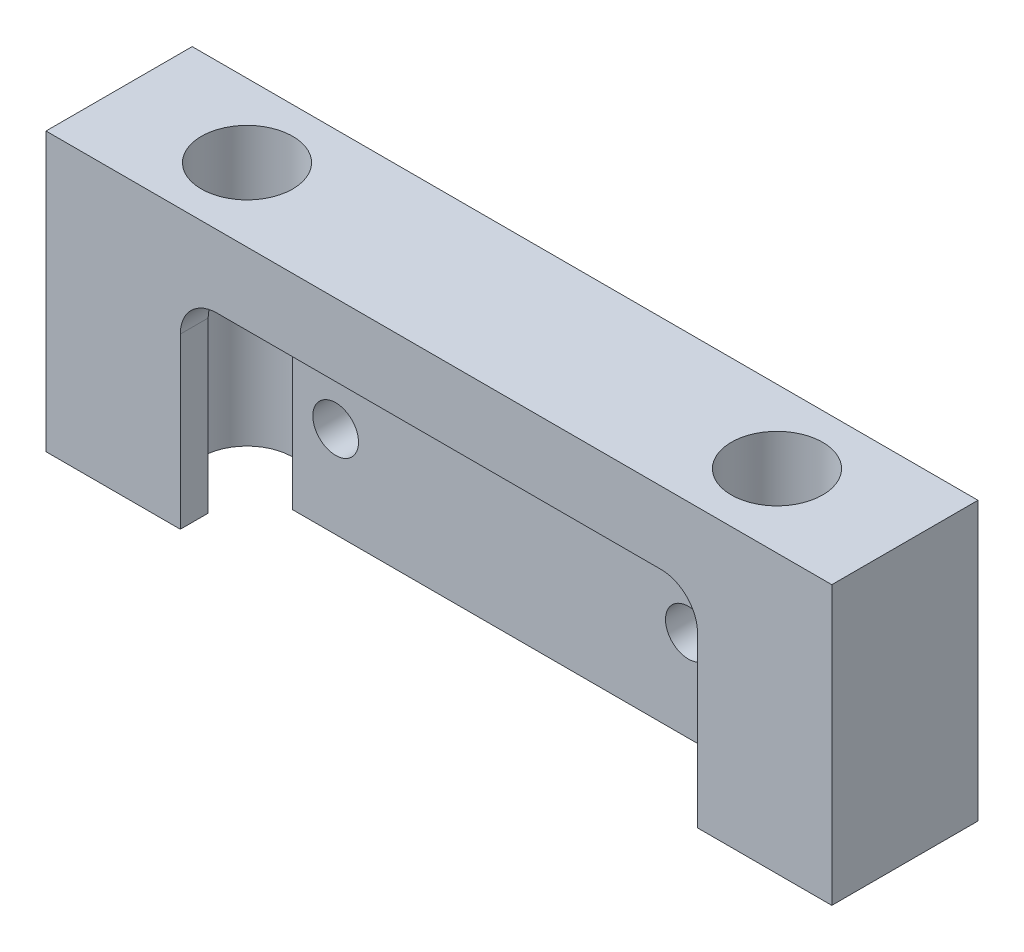
ISO-10303-21;
HEADER;
FILE_DESCRIPTION(('STEP AP214'),'2;1');
FILE_NAME('part.step','',(''),(''),'','','');
FILE_SCHEMA(('AUTOMOTIVE_DESIGN { 1 0 10303 214 1 1 1 1 }'));
ENDSEC;
DATA;
#1=APPLICATION_CONTEXT('core data for automotive mechanical design processes');
#2=APPLICATION_PROTOCOL_DEFINITION('international standard','automotive_design',2000,#1);
#3=PRODUCT_CONTEXT('',#1,'mechanical');
#4=PRODUCT('Part','Part','',(#3));
#5=PRODUCT_RELATED_PRODUCT_CATEGORY('part','',(#4));
#6=PRODUCT_DEFINITION_FORMATION('','',#4);
#7=PRODUCT_DEFINITION_CONTEXT('part definition',#1,'design');
#8=PRODUCT_DEFINITION('design','',#6,#7);
#9=PRODUCT_DEFINITION_SHAPE('','',#8);
#10=(LENGTH_UNIT() NAMED_UNIT(*) SI_UNIT(.MILLI.,.METRE.));
#11=(NAMED_UNIT(*) PLANE_ANGLE_UNIT() SI_UNIT($,.RADIAN.));
#12=(NAMED_UNIT(*) SI_UNIT($,.STERADIAN.) SOLID_ANGLE_UNIT());
#13=UNCERTAINTY_MEASURE_WITH_UNIT(LENGTH_MEASURE(1.E-05),#10,'distance_accuracy_value','');
#14=(GEOMETRIC_REPRESENTATION_CONTEXT(3) GLOBAL_UNCERTAINTY_ASSIGNED_CONTEXT((#13)) GLOBAL_UNIT_ASSIGNED_CONTEXT((#10,
#11,#12)) REPRESENTATION_CONTEXT('',''));
#15=CARTESIAN_POINT('',(0.,0.,0.));
#16=DIRECTION('',(0.,0.,1.));
#17=DIRECTION('',(1.,0.,0.));
#18=AXIS2_PLACEMENT_3D('',#15,#16,#17);
#19=CARTESIAN_POINT('',(-9.65,-2.60000000000001,4.));
#20=DIRECTION('',(0.,0.,1.));
#21=DIRECTION('',(1.,0.,0.));
#22=AXIS2_PLACEMENT_3D('',#19,#20,#21);
#23=CYLINDRICAL_SURFACE('',#22,1.24999999999999);
#24=CARTESIAN_POINT('',(-9.65,-2.60000000000001,4.));
#25=DIRECTION('',(0.,0.,-1.));
#26=DIRECTION('',(-1.,0.,0.));
#27=AXIS2_PLACEMENT_3D('',#24,#25,#26);
#28=CIRCLE('',#27,1.24999999999999);
#29=CARTESIAN_POINT('',(-10.9,-2.60000000000001,4.));
#30=VERTEX_POINT('',#29);
#31=EDGE_CURVE('E11',#30,#30,#28,.F.);
#32=ORIENTED_EDGE('',*,*,#31,.T.);
#33=EDGE_LOOP('',(#32));
#34=FACE_BOUND('',#33,.T.);
#35=CARTESIAN_POINT('',(-9.65,-2.60000000000001,0.));
#36=DIRECTION('',(0.,0.,1.));
#37=DIRECTION('',(1.,0.,0.));
#38=AXIS2_PLACEMENT_3D('',#35,#36,#37);
#39=CIRCLE('',#38,1.24999999999999);
#40=CARTESIAN_POINT('',(-8.40000000000001,-2.60000000000001,0.));
#41=VERTEX_POINT('',#40);
#42=EDGE_CURVE('E193',#41,#41,#39,.T.);
#43=ORIENTED_EDGE('',*,*,#42,.F.);
#44=EDGE_LOOP('',(#43));
#45=FACE_BOUND('',#44,.T.);
#46=ADVANCED_FACE('F16',(#34,#45),#23,.F.);
#47=CARTESIAN_POINT('',(9.65,-2.60000000000001,4.));
#48=DIRECTION('',(0.,0.,1.));
#49=DIRECTION('',(1.,0.,0.));
#50=AXIS2_PLACEMENT_3D('',#47,#48,#49);
#51=CYLINDRICAL_SURFACE('',#50,1.24999999999999);
#52=CARTESIAN_POINT('',(9.65,-2.60000000000001,4.));
#53=DIRECTION('',(0.,0.,-1.));
#54=DIRECTION('',(-1.,0.,0.));
#55=AXIS2_PLACEMENT_3D('',#52,#53,#54);
#56=CIRCLE('',#55,1.24999999999999);
#57=CARTESIAN_POINT('',(8.40000000000001,-2.60000000000001,4.));
#58=VERTEX_POINT('',#57);
#59=EDGE_CURVE('E32',#58,#58,#56,.F.);
#60=ORIENTED_EDGE('',*,*,#59,.T.);
#61=EDGE_LOOP('',(#60));
#62=FACE_BOUND('',#61,.T.);
#63=CARTESIAN_POINT('',(9.65,-2.60000000000001,0.));
#64=DIRECTION('',(0.,0.,1.));
#65=DIRECTION('',(1.,0.,0.));
#66=AXIS2_PLACEMENT_3D('',#63,#64,#65);
#67=CIRCLE('',#66,1.24999999999999);
#68=CARTESIAN_POINT('',(10.9,-2.60000000000001,0.));
#69=VERTEX_POINT('',#68);
#70=EDGE_CURVE('E196',#69,#69,#67,.T.);
#71=ORIENTED_EDGE('',*,*,#70,.F.);
#72=EDGE_LOOP('',(#71));
#73=FACE_BOUND('',#72,.T.);
#74=ADVANCED_FACE('F227',(#62,#73),#51,.F.);
#75=CARTESIAN_POINT('',(14.5,-7.6,4.));
#76=DIRECTION('',(0.,1.,0.));
#77=DIRECTION('',(1.,0.,0.));
#78=AXIS2_PLACEMENT_3D('',#75,#76,#77);
#79=CYLINDRICAL_SURFACE('',#78,2.5);
#80=CARTESIAN_POINT('',(14.5,7.6,4.));
#81=DIRECTION('',(0.,-1.,0.));
#82=DIRECTION('',(1.,0.,0.));
#83=AXIS2_PLACEMENT_3D('',#80,#81,#82);
#84=CIRCLE('',#83,2.5);
#85=CARTESIAN_POINT('',(17.,7.6,4.));
#86=VERTEX_POINT('',#85);
#87=EDGE_CURVE('E147',#86,#86,#84,.F.);
#88=ORIENTED_EDGE('',*,*,#87,.T.);
#89=EDGE_LOOP('',(#88));
#90=FACE_BOUND('',#89,.T.);
#91=CARTESIAN_POINT('',(14.5,-7.6,4.));
#92=DIRECTION('',(0.,1.,0.));
#93=DIRECTION('',(-1.,0.,0.));
#94=AXIS2_PLACEMENT_3D('',#91,#92,#93);
#95=CIRCLE('',#94,2.5);
#96=CARTESIAN_POINT('',(14.15,-7.6,6.47537875889731));
#97=VERTEX_POINT('',#96);
#98=CARTESIAN_POINT('',(12.,-7.6,4.));
#99=VERTEX_POINT('',#98);
#100=EDGE_CURVE('E158',#97,#99,#95,.T.);
#101=ORIENTED_EDGE('',*,*,#100,.F.);
#102=DIRECTION('',(0.,1.,0.));
#103=VECTOR('',#102,1.);
#104=CARTESIAN_POINT('',(14.15,-7.6,6.47537875889731));
#105=LINE('',#104,#103);
#106=CARTESIAN_POINT('',(14.15,1.65,6.47537875889731));
#107=VERTEX_POINT('',#106);
#108=EDGE_CURVE('E41',#107,#97,#105,.F.);
#109=ORIENTED_EDGE('',*,*,#108,.F.);
#110=CARTESIAN_POINT('',(12.15,3.65,4.85293610546162));
#111=CARTESIAN_POINT('',(12.1717848541757,3.6499871335958,4.91297632023183));
#112=CARTESIAN_POINT('',(12.1958851193623,3.64964359380251,4.97218391836945));
#113=CARTESIAN_POINT('',(12.2485565277098,3.64774763479541,5.088614005451));
#114=CARTESIAN_POINT('',(12.2771314052821,3.6461942014892,5.14583478706523));
#115=CARTESIAN_POINT('',(12.3387238981192,3.64131572400631,5.25817756561177));
#116=CARTESIAN_POINT('',(12.3717650914862,3.63798097980139,5.3132862833861));
#117=CARTESIAN_POINT('',(12.441866450778,3.62890478108905,5.42063382000006));
#118=CARTESIAN_POINT('',(12.4789250214157,3.62316427932358,5.47287376569442));
#119=CARTESIAN_POINT('',(12.5832367522469,3.60364526187424,5.60856830992434));
#120=CARTESIAN_POINT('',(12.6538863816249,3.58705530510053,5.68909318330374));
#121=CARTESIAN_POINT('',(12.8027915276664,3.54205638987283,5.83863536146666));
#122=CARTESIAN_POINT('',(12.8810233613841,3.5136833782133,5.90768677909109));
#123=CARTESIAN_POINT('',(13.0419027406321,3.44228584391287,6.03333042357918));
#124=CARTESIAN_POINT('',(13.1245783709508,3.39915579430451,6.08982794014689));
#125=CARTESIAN_POINT('',(13.2885707699964,3.29710695990994,6.1889806137309));
#126=CARTESIAN_POINT('',(13.3698871708759,3.23818397229663,6.23163207933636));
#127=CARTESIAN_POINT('',(13.5170385341964,3.1127074452584,6.29992387515111));
#128=CARTESIAN_POINT('',(13.5835908695181,3.04772011568174,6.32692445982034));
#129=CARTESIAN_POINT('',(13.7081444716002,2.90737303688636,6.37220650898323));
#130=CARTESIAN_POINT('',(13.7661454883834,2.83201298457052,6.39048771862185));
#131=CARTESIAN_POINT('',(13.8724516561465,2.67111528761236,6.42060199615144));
#132=CARTESIAN_POINT('',(13.9205111454733,2.58538782544805,6.43228182433444));
#133=CARTESIAN_POINT('',(14.0036882675448,2.40729602295369,6.45061210329801));
#134=CARTESIAN_POINT('',(14.0387991004357,2.31492822585565,6.4572599134891));
#135=CARTESIAN_POINT('',(14.0806630129234,2.17428327920328,6.46461816844701));
#136=CARTESIAN_POINT('',(14.0927398056377,2.12758777760779,6.46662684664851));
#137=CARTESIAN_POINT('',(14.1134959264118,2.03341303868675,6.46996492167655));
#138=CARTESIAN_POINT('',(14.1221752531751,1.98593380106214,6.47129431824387));
#139=CARTESIAN_POINT('',(14.1360713587403,1.8905067949881,6.47337977689398));
#140=CARTESIAN_POINT('',(14.1412913298037,1.84255950004259,6.47413636764879));
#141=CARTESIAN_POINT('',(14.1482571997862,1.74640854310065,6.4751321348508));
#142=CARTESIAN_POINT('',(14.15000314968,1.69820488487628,6.47537131888998));
#143=CARTESIAN_POINT('',(14.15,1.65,6.47537875889731));
#144=B_SPLINE_CURVE_WITH_KNOTS('',3,(#110,#111,#112,#113,#114,#115,#116,#117,#118,#119,#120,
#121,#122,#123,#124,#125,#126,#127,#128,#129,#130,#131,#132,#133,#134,#135,#136,#137,#138,#139,
#140,#141,#142,#143),.UNSPECIFIED.,.F.,.F.,(4,2,2,2,2,2,2,2,2,2,2,2,2,2,2,2,4),(0.,
0.191573364124514,0.383307471684327,0.576096462140483,0.768809175232548,1.09256623422289,
1.41534277355889,1.74047746189534,2.06569876134767,2.35492692554187,2.64416354294939,
2.93986427487028,3.23572007061787,3.38043592307214,3.52515183075043,3.66973400927846,
3.81431406632033),.UNSPECIFIED.);
#145=CARTESIAN_POINT('',(12.15,3.65,4.85293610546161));
#146=VERTEX_POINT('',#145);
#147=EDGE_CURVE('E130',#146,#107,#144,.T.);
#148=ORIENTED_EDGE('',*,*,#147,.F.);
#149=CARTESIAN_POINT('',(14.5,3.65,4.));
#150=DIRECTION('',(0.,1.,0.));
#151=DIRECTION('',(-1.,0.,0.));
#152=AXIS2_PLACEMENT_3D('',#149,#150,#151);
#153=CIRCLE('',#152,2.5);
#154=CARTESIAN_POINT('',(12.,3.65,4.));
#155=VERTEX_POINT('',#154);
#156=EDGE_CURVE('E203',#155,#146,#153,.T.);
#157=ORIENTED_EDGE('',*,*,#156,.F.);
#158=DIRECTION('',(0.,1.,0.));
#159=VECTOR('',#158,1.);
#160=CARTESIAN_POINT('',(12.,-7.6,4.));
#161=LINE('',#160,#159);
#162=EDGE_CURVE('E211',#99,#155,#161,.T.);
#163=ORIENTED_EDGE('',*,*,#162,.F.);
#164=EDGE_LOOP('',(#101,#109,#148,#157,#163));
#165=FACE_BOUND('',#164,.T.);
#166=ADVANCED_FACE('F222',(#90,#165),#79,.F.);
#167=CARTESIAN_POINT('',(-14.5,-7.60000000000001,4.));
#168=DIRECTION('',(0.,1.,0.));
#169=DIRECTION('',(1.,0.,0.));
#170=AXIS2_PLACEMENT_3D('',#167,#168,#169);
#171=CYLINDRICAL_SURFACE('',#170,2.5);
#172=CARTESIAN_POINT('',(-14.5,7.6,4.));
#173=DIRECTION('',(0.,-1.,0.));
#174=DIRECTION('',(1.,0.,0.));
#175=AXIS2_PLACEMENT_3D('',#172,#173,#174);
#176=CIRCLE('',#175,2.5);
#177=CARTESIAN_POINT('',(-12.,7.6,4.));
#178=VERTEX_POINT('',#177);
#179=EDGE_CURVE('E150',#178,#178,#176,.F.);
#180=ORIENTED_EDGE('',*,*,#179,.T.);
#181=EDGE_LOOP('',(#180));
#182=FACE_BOUND('',#181,.T.);
#183=CARTESIAN_POINT('',(-14.5,3.65,4.));
#184=DIRECTION('',(0.,1.,0.));
#185=DIRECTION('',(-1.,0.,0.));
#186=AXIS2_PLACEMENT_3D('',#183,#184,#185);
#187=CIRCLE('',#186,2.5);
#188=CARTESIAN_POINT('',(-12.15,3.65,4.85293610546159));
#189=VERTEX_POINT('',#188);
#190=CARTESIAN_POINT('',(-12.,3.65,4.));
#191=VERTEX_POINT('',#190);
#192=EDGE_CURVE('E131',#189,#191,#187,.T.);
#193=ORIENTED_EDGE('',*,*,#192,.F.);
#194=CARTESIAN_POINT('',(-14.15,1.65,6.47537875889731));
#195=CARTESIAN_POINT('',(-14.1500053011323,1.70478702467306,6.47536635596544));
#196=CARTESIAN_POINT('',(-14.1477487701209,1.75957234643407,6.47506010372739));
#197=CARTESIAN_POINT('',(-14.1387524835034,1.86876856526418,6.47377001510014));
#198=CARTESIAN_POINT('',(-14.1320124836023,1.9231794417673,6.47278614178865));
#199=CARTESIAN_POINT('',(-14.1140757701269,2.03133373596184,6.47004878027615));
#200=CARTESIAN_POINT('',(-14.102872141626,2.08507598399283,6.46829409752427));
#201=CARTESIAN_POINT('',(-14.0761072786828,2.19140681489919,6.46383781559259));
#202=CARTESIAN_POINT('',(-14.0605461736897,2.24399543199584,6.46113624454174));
#203=CARTESIAN_POINT('',(-14.0074406562105,2.3996011709513,6.4512665735049));
#204=CARTESIAN_POINT('',(-13.9634811245526,2.50041577048981,6.4423342422425));
#205=CARTESIAN_POINT('',(-13.8601681369992,2.69270226248533,6.41731584692656));
#206=CARTESIAN_POINT('',(-13.8008313848771,2.78418414341779,6.40123753185517));
#207=CARTESIAN_POINT('',(-13.6717123908078,2.9519974355581,6.35973761317314));
#208=CARTESIAN_POINT('',(-13.602361931476,3.02874313007325,6.3346580563977));
#209=CARTESIAN_POINT('',(-13.4555429730124,3.16849012837471,6.27275625967399));
#210=CARTESIAN_POINT('',(-13.3780793332371,3.23149959051391,6.23594102206312));
#211=CARTESIAN_POINT('',(-13.2263404156018,3.33801240211442,6.15282306326335));
#212=CARTESIAN_POINT('',(-13.1523238651074,3.38269090895966,6.10754473111774));
#213=CARTESIAN_POINT('',(-13.0054499514737,3.45972019695902,6.00606078299607));
#214=CARTESIAN_POINT('',(-12.9325923081803,3.4920740022555,5.9498578527339));
#215=CARTESIAN_POINT('',(-12.7911760018636,3.54595810254096,5.82721855028164));
#216=CARTESIAN_POINT('',(-12.7226362324368,3.56744337980749,5.76074107986347));
#217=CARTESIAN_POINT('',(-12.592603936005,3.60157296150226,5.61898450448597));
#218=CARTESIAN_POINT('',(-12.5311254337446,3.61419991749379,5.54368846342881));
#219=CARTESIAN_POINT('',(-12.4402463306546,3.62912482053972,5.4180161881708));
#220=CARTESIAN_POINT('',(-12.4079521495216,3.63353495144657,5.36992624820737));
#221=CARTESIAN_POINT('',(-12.3467154567474,3.64054071068383,5.27150383127895));
#222=CARTESIAN_POINT('',(-12.3177739020039,3.64313582203561,5.22117071972222));
#223=CARTESIAN_POINT('',(-12.2635503527716,3.64695899538783,5.11876618134142));
#224=CARTESIAN_POINT('',(-12.2382552599225,3.64819206202719,5.06670184729564));
#225=CARTESIAN_POINT('',(-12.1913431247982,3.64970792142554,4.96096406949017));
#226=CARTESIAN_POINT('',(-12.1697239175665,3.64999127538227,4.90729159492858));
#227=CARTESIAN_POINT('',(-12.15,3.65,4.85293610546159));
#228=B_SPLINE_CURVE_WITH_KNOTS('',3,(#194,#195,#196,#197,#198,#199,#200,#201,#202,#203,#204,
#205,#206,#207,#208,#209,#210,#211,#212,#213,#214,#215,#216,#217,#218,#219,#220,#221,#222,#223,
#224,#225,#226,#227),.UNSPECIFIED.,.F.,.F.,(4,2,2,2,2,2,2,2,2,2,2,2,2,2,2,2,4),(0.,
0.164310472031176,0.328629897735674,0.49320487846602,0.657774970627656,0.987042541100508,
1.31595392733161,1.63350005686234,1.95085706944308,2.24221391527824,2.53349922404638,
2.82598136270438,3.1190347211887,3.29317124815929,3.46735735489327,3.6409012883896,
3.81434265439086),.UNSPECIFIED.);
#229=CARTESIAN_POINT('',(-14.15,1.65,6.47537875889731));
#230=VERTEX_POINT('',#229);
#231=EDGE_CURVE('E21',#230,#189,#228,.T.);
#232=ORIENTED_EDGE('',*,*,#231,.F.);
#233=DIRECTION('',(0.,1.,0.));
#234=VECTOR('',#233,1.);
#235=CARTESIAN_POINT('',(-14.15,-7.60000000000001,6.47537875889731));
#236=LINE('',#235,#234);
#237=CARTESIAN_POINT('',(-14.15,-7.6,6.47537875889731));
#238=VERTEX_POINT('',#237);
#239=EDGE_CURVE('E142',#238,#230,#236,.T.);
#240=ORIENTED_EDGE('',*,*,#239,.F.);
#241=CARTESIAN_POINT('',(-14.5,-7.6,4.));
#242=DIRECTION('',(0.,1.,0.));
#243=DIRECTION('',(-1.,0.,0.));
#244=AXIS2_PLACEMENT_3D('',#241,#242,#243);
#245=CIRCLE('',#244,2.5);
#246=CARTESIAN_POINT('',(-12.,-7.6,4.));
#247=VERTEX_POINT('',#246);
#248=EDGE_CURVE('E161',#247,#238,#245,.T.);
#249=ORIENTED_EDGE('',*,*,#248,.F.);
#250=DIRECTION('',(0.,1.,0.));
#251=VECTOR('',#250,1.);
#252=CARTESIAN_POINT('',(-12.,-7.60000000000001,4.));
#253=LINE('',#252,#251);
#254=EDGE_CURVE('E216',#191,#247,#253,.F.);
#255=ORIENTED_EDGE('',*,*,#254,.F.);
#256=EDGE_LOOP('',(#193,#232,#240,#249,#255));
#257=FACE_BOUND('',#256,.T.);
#258=ADVANCED_FACE('F226',(#182,#257),#171,.F.);
#259=CARTESIAN_POINT('',(-21.5,-7.6,8.));
#260=DIRECTION('',(1.,0.,0.));
#261=DIRECTION('',(0.,0.,-1.));
#262=AXIS2_PLACEMENT_3D('',#259,#260,#261);
#263=PLANE('',#262);
#264=DIRECTION('',(0.,-1.,0.));
#265=VECTOR('',#264,1.);
#266=CARTESIAN_POINT('',(-21.5,-7.6,0.));
#267=LINE('',#266,#265);
#268=CARTESIAN_POINT('',(-21.5,7.6,0.));
#269=VERTEX_POINT('',#268);
#270=CARTESIAN_POINT('',(-21.5,-7.6,0.));
#271=VERTEX_POINT('',#270);
#272=EDGE_CURVE('E153',#269,#271,#267,.T.);
#273=ORIENTED_EDGE('',*,*,#272,.T.);
#274=DIRECTION('',(0.,0.,-1.));
#275=VECTOR('',#274,1.);
#276=CARTESIAN_POINT('',(-21.5,-7.6,8.));
#277=LINE('',#276,#275);
#278=CARTESIAN_POINT('',(-21.5,-7.6,8.));
#279=VERTEX_POINT('',#278);
#280=EDGE_CURVE('E167',#279,#271,#277,.T.);
#281=ORIENTED_EDGE('',*,*,#280,.F.);
#282=DIRECTION('',(0.,1.,0.));
#283=VECTOR('',#282,1.);
#284=CARTESIAN_POINT('',(-21.5,0.,8.));
#285=LINE('',#284,#283);
#286=CARTESIAN_POINT('',(-21.5,7.6,8.));
#287=VERTEX_POINT('',#286);
#288=EDGE_CURVE('E189',#287,#279,#285,.F.);
#289=ORIENTED_EDGE('',*,*,#288,.F.);
#290=DIRECTION('',(0.,0.,-1.));
#291=VECTOR('',#290,1.);
#292=CARTESIAN_POINT('',(-21.5,7.6,8.));
#293=LINE('',#292,#291);
#294=EDGE_CURVE('E156',#287,#269,#293,.T.);
#295=ORIENTED_EDGE('',*,*,#294,.T.);
#296=EDGE_LOOP('',(#273,#281,#289,#295));
#297=FACE_BOUND('',#296,.T.);
#298=ADVANCED_FACE('F232',(#297),#263,.F.);
#299=CARTESIAN_POINT('',(21.5,-7.6,8.));
#300=DIRECTION('',(0.,1.,0.));
#301=DIRECTION('',(-1.,0.,0.));
#302=AXIS2_PLACEMENT_3D('',#299,#300,#301);
#303=PLANE('',#302);
#304=DIRECTION('',(0.,0.,1.));
#305=VECTOR('',#304,1.);
#306=CARTESIAN_POINT('',(14.15,-7.6,4.));
#307=LINE('',#306,#305);
#308=CARTESIAN_POINT('',(14.15,-7.6,8.));
#309=VERTEX_POINT('',#308);
#310=EDGE_CURVE('E118',#97,#309,#307,.T.);
#311=ORIENTED_EDGE('',*,*,#310,.F.);
#312=ORIENTED_EDGE('',*,*,#100,.T.);
#313=DIRECTION('',(1.,0.,0.));
#314=VECTOR('',#313,1.);
#315=CARTESIAN_POINT('',(0.,-7.6,4.));
#316=LINE('',#315,#314);
#317=EDGE_CURVE('E120',#247,#99,#316,.T.);
#318=ORIENTED_EDGE('',*,*,#317,.F.);
#319=ORIENTED_EDGE('',*,*,#248,.T.);
#320=DIRECTION('',(0.,0.,1.));
#321=VECTOR('',#320,1.);
#322=CARTESIAN_POINT('',(-14.15,-7.6,8.));
#323=LINE('',#322,#321);
#324=CARTESIAN_POINT('',(-14.15,-7.6,8.));
#325=VERTEX_POINT('',#324);
#326=EDGE_CURVE('E164',#238,#325,#323,.T.);
#327=ORIENTED_EDGE('',*,*,#326,.T.);
#328=DIRECTION('',(-1.,0.,0.));
#329=VECTOR('',#328,1.);
#330=CARTESIAN_POINT('',(0.,-7.6,8.));
#331=LINE('',#330,#329);
#332=EDGE_CURVE('E191',#279,#325,#331,.F.);
#333=ORIENTED_EDGE('',*,*,#332,.F.);
#334=ORIENTED_EDGE('',*,*,#280,.T.);
#335=DIRECTION('',(1.,0.,0.));
#336=VECTOR('',#335,1.);
#337=CARTESIAN_POINT('',(21.5,-7.6,0.));
#338=LINE('',#337,#336);
#339=CARTESIAN_POINT('',(21.5,-7.6,0.));
#340=VERTEX_POINT('',#339);
#341=EDGE_CURVE('E169',#271,#340,#338,.T.);
#342=ORIENTED_EDGE('',*,*,#341,.T.);
#343=DIRECTION('',(0.,0.,-1.));
#344=VECTOR('',#343,1.);
#345=CARTESIAN_POINT('',(21.5,-7.6,8.));
#346=LINE('',#345,#344);
#347=CARTESIAN_POINT('',(21.5,-7.6,8.));
#348=VERTEX_POINT('',#347);
#349=EDGE_CURVE('E175',#348,#340,#346,.T.);
#350=ORIENTED_EDGE('',*,*,#349,.F.);
#351=DIRECTION('',(-1.,0.,0.));
#352=VECTOR('',#351,1.);
#353=CARTESIAN_POINT('',(0.,-7.6,8.));
#354=LINE('',#353,#352);
#355=EDGE_CURVE('E128',#309,#348,#354,.F.);
#356=ORIENTED_EDGE('',*,*,#355,.F.);
#357=EDGE_LOOP('',(#311,#312,#318,#319,#327,#333,#334,#342,#350,#356));
#358=FACE_BOUND('',#357,.T.);
#359=ADVANCED_FACE('F278',(#358),#303,.F.);
#360=CARTESIAN_POINT('',(21.5,-7.6,8.));
#361=DIRECTION('',(-1.,0.,0.));
#362=DIRECTION('',(0.,0.,1.));
#363=AXIS2_PLACEMENT_3D('',#360,#361,#362);
#364=PLANE('',#363);
#365=DIRECTION('',(0.,1.,0.));
#366=VECTOR('',#365,1.);
#367=CARTESIAN_POINT('',(21.5,-7.6,0.));
#368=LINE('',#367,#366);
#369=CARTESIAN_POINT('',(21.5,7.6,0.));
#370=VERTEX_POINT('',#369);
#371=EDGE_CURVE('E172',#340,#370,#368,.T.);
#372=ORIENTED_EDGE('',*,*,#371,.T.);
#373=DIRECTION('',(0.,0.,-1.));
#374=VECTOR('',#373,1.);
#375=CARTESIAN_POINT('',(21.5,7.6,8.));
#376=LINE('',#375,#374);
#377=CARTESIAN_POINT('',(21.5,7.6,8.));
#378=VERTEX_POINT('',#377);
#379=EDGE_CURVE('E180',#378,#370,#376,.T.);
#380=ORIENTED_EDGE('',*,*,#379,.F.);
#381=DIRECTION('',(0.,-1.,0.));
#382=VECTOR('',#381,1.);
#383=CARTESIAN_POINT('',(21.5,0.,8.));
#384=LINE('',#383,#382);
#385=EDGE_CURVE('E184',#348,#378,#384,.F.);
#386=ORIENTED_EDGE('',*,*,#385,.F.);
#387=ORIENTED_EDGE('',*,*,#349,.T.);
#388=EDGE_LOOP('',(#372,#380,#386,#387));
#389=FACE_BOUND('',#388,.T.);
#390=ADVANCED_FACE('F274',(#389),#364,.F.);
#391=CARTESIAN_POINT('',(21.5,7.6,8.));
#392=DIRECTION('',(0.,-1.,0.));
#393=DIRECTION('',(1.,0.,0.));
#394=AXIS2_PLACEMENT_3D('',#391,#392,#393);
#395=PLANE('',#394);
#396=DIRECTION('',(-1.,0.,0.));
#397=VECTOR('',#396,1.);
#398=CARTESIAN_POINT('',(21.5,7.6,0.));
#399=LINE('',#398,#397);
#400=EDGE_CURVE('E177',#370,#269,#399,.T.);
#401=ORIENTED_EDGE('',*,*,#400,.T.);
#402=ORIENTED_EDGE('',*,*,#294,.F.);
#403=DIRECTION('',(1.,0.,0.));
#404=VECTOR('',#403,1.);
#405=CARTESIAN_POINT('',(0.,7.6,8.));
#406=LINE('',#405,#404);
#407=EDGE_CURVE('E186',#378,#287,#406,.F.);
#408=ORIENTED_EDGE('',*,*,#407,.F.);
#409=ORIENTED_EDGE('',*,*,#379,.T.);
#410=EDGE_LOOP('',(#401,#402,#408,#409));
#411=FACE_BOUND('',#410,.T.);
#412=ORIENTED_EDGE('',*,*,#87,.F.);
#413=EDGE_LOOP('',(#412));
#414=FACE_BOUND('',#413,.T.);
#415=ORIENTED_EDGE('',*,*,#179,.F.);
#416=EDGE_LOOP('',(#415));
#417=FACE_BOUND('',#416,.T.);
#418=ADVANCED_FACE('F271',(#411,#414,#417),#395,.F.);
#419=CARTESIAN_POINT('',(0.,0.,8.));
#420=DIRECTION('',(0.,0.,1.));
#421=DIRECTION('',(1.,0.,0.));
#422=AXIS2_PLACEMENT_3D('',#419,#420,#421);
#423=PLANE('',#422);
#424=DIRECTION('',(0.,1.,0.));
#425=VECTOR('',#424,1.);
#426=CARTESIAN_POINT('',(-14.15,3.65,8.));
#427=LINE('',#426,#425);
#428=CARTESIAN_POINT('',(-14.15,1.65,8.));
#429=VERTEX_POINT('',#428);
#430=EDGE_CURVE('E143',#429,#325,#427,.F.);
#431=ORIENTED_EDGE('',*,*,#430,.F.);
#432=CARTESIAN_POINT('',(-12.15,1.65,8.));
#433=DIRECTION('',(0.,0.,1.));
#434=DIRECTION('',(1.,0.,0.));
#435=AXIS2_PLACEMENT_3D('',#432,#433,#434);
#436=CIRCLE('',#435,2.);
#437=CARTESIAN_POINT('',(-12.15,3.65,8.));
#438=VERTEX_POINT('',#437);
#439=EDGE_CURVE('E127',#429,#438,#436,.F.);
#440=ORIENTED_EDGE('',*,*,#439,.T.);
#441=DIRECTION('',(1.,0.,0.));
#442=VECTOR('',#441,1.);
#443=CARTESIAN_POINT('',(14.15,3.65,8.));
#444=LINE('',#443,#442);
#445=CARTESIAN_POINT('',(12.15,3.65,8.));
#446=VERTEX_POINT('',#445);
#447=EDGE_CURVE('E109',#446,#438,#444,.F.);
#448=ORIENTED_EDGE('',*,*,#447,.F.);
#449=CARTESIAN_POINT('',(12.15,1.65,8.));
#450=DIRECTION('',(0.,0.,1.));
#451=DIRECTION('',(1.,0.,0.));
#452=AXIS2_PLACEMENT_3D('',#449,#450,#451);
#453=CIRCLE('',#452,2.);
#454=CARTESIAN_POINT('',(14.15,1.65,8.));
#455=VERTEX_POINT('',#454);
#456=EDGE_CURVE('E122',#446,#455,#453,.F.);
#457=ORIENTED_EDGE('',*,*,#456,.T.);
#458=DIRECTION('',(0.,-1.,0.));
#459=VECTOR('',#458,1.);
#460=CARTESIAN_POINT('',(14.15,3.65,8.));
#461=LINE('',#460,#459);
#462=EDGE_CURVE('E113',#309,#455,#461,.F.);
#463=ORIENTED_EDGE('',*,*,#462,.F.);
#464=ORIENTED_EDGE('',*,*,#355,.T.);
#465=ORIENTED_EDGE('',*,*,#385,.T.);
#466=ORIENTED_EDGE('',*,*,#407,.T.);
#467=ORIENTED_EDGE('',*,*,#288,.T.);
#468=ORIENTED_EDGE('',*,*,#332,.T.);
#469=EDGE_LOOP('',(#431,#440,#448,#457,#463,#464,#465,#466,#467,#468));
#470=FACE_BOUND('',#469,.T.);
#471=ADVANCED_FACE('F123',(#470),#423,.T.);
#472=CARTESIAN_POINT('',(0.,0.,0.));
#473=DIRECTION('',(0.,0.,1.));
#474=DIRECTION('',(1.,0.,0.));
#475=AXIS2_PLACEMENT_3D('',#472,#473,#474);
#476=PLANE('',#475);
#477=ORIENTED_EDGE('',*,*,#272,.F.);
#478=ORIENTED_EDGE('',*,*,#400,.F.);
#479=ORIENTED_EDGE('',*,*,#371,.F.);
#480=ORIENTED_EDGE('',*,*,#341,.F.);
#481=EDGE_LOOP('',(#477,#478,#479,#480));
#482=FACE_BOUND('',#481,.T.);
#483=ORIENTED_EDGE('',*,*,#42,.T.);
#484=EDGE_LOOP('',(#483));
#485=FACE_BOUND('',#484,.T.);
#486=ORIENTED_EDGE('',*,*,#70,.T.);
#487=EDGE_LOOP('',(#486));
#488=FACE_BOUND('',#487,.T.);
#489=ADVANCED_FACE('F264',(#482,#485,#488),#476,.F.);
#490=CARTESIAN_POINT('',(-14.15,3.65,4.));
#491=DIRECTION('',(-1.,0.,0.));
#492=DIRECTION('',(0.,-1.,0.));
#493=AXIS2_PLACEMENT_3D('',#490,#491,#492);
#494=PLANE('',#493);
#495=ORIENTED_EDGE('',*,*,#326,.F.);
#496=ORIENTED_EDGE('',*,*,#239,.T.);
#497=DIRECTION('',(0.,0.,1.));
#498=VECTOR('',#497,1.);
#499=CARTESIAN_POINT('',(-14.15,1.65,8.));
#500=LINE('',#499,#498);
#501=EDGE_CURVE('E140',#230,#429,#500,.T.);
#502=ORIENTED_EDGE('',*,*,#501,.T.);
#503=ORIENTED_EDGE('',*,*,#430,.T.);
#504=EDGE_LOOP('',(#495,#496,#502,#503));
#505=FACE_BOUND('',#504,.T.);
#506=ADVANCED_FACE('F260',(#505),#494,.F.);
#507=CARTESIAN_POINT('',(14.15,3.65,4.));
#508=DIRECTION('',(0.,1.,0.));
#509=DIRECTION('',(-1.,0.,0.));
#510=AXIS2_PLACEMENT_3D('',#507,#508,#509);
#511=PLANE('',#510);
#512=DIRECTION('',(1.,0.,0.));
#513=VECTOR('',#512,1.);
#514=CARTESIAN_POINT('',(0.,3.65,4.));
#515=LINE('',#514,#513);
#516=EDGE_CURVE('E213',#155,#191,#515,.F.);
#517=ORIENTED_EDGE('',*,*,#516,.F.);
#518=ORIENTED_EDGE('',*,*,#156,.T.);
#519=DIRECTION('',(0.,0.,1.));
#520=VECTOR('',#519,1.);
#521=CARTESIAN_POINT('',(12.15,3.65,8.));
#522=LINE('',#521,#520);
#523=EDGE_CURVE('E206',#146,#446,#522,.T.);
#524=ORIENTED_EDGE('',*,*,#523,.T.);
#525=ORIENTED_EDGE('',*,*,#447,.T.);
#526=DIRECTION('',(0.,0.,-1.));
#527=VECTOR('',#526,1.);
#528=CARTESIAN_POINT('',(-12.15,3.65,4.));
#529=LINE('',#528,#527);
#530=EDGE_CURVE('E134',#438,#189,#529,.T.);
#531=ORIENTED_EDGE('',*,*,#530,.T.);
#532=ORIENTED_EDGE('',*,*,#192,.T.);
#533=EDGE_LOOP('',(#517,#518,#524,#525,#531,#532));
#534=FACE_BOUND('',#533,.T.);
#535=ADVANCED_FACE('F257',(#534),#511,.F.);
#536=CARTESIAN_POINT('',(14.15,3.65,4.));
#537=DIRECTION('',(1.,0.,0.));
#538=DIRECTION('',(0.,1.,0.));
#539=AXIS2_PLACEMENT_3D('',#536,#537,#538);
#540=PLANE('',#539);
#541=DIRECTION('',(0.,0.,-1.));
#542=VECTOR('',#541,1.);
#543=CARTESIAN_POINT('',(14.15,1.65,4.));
#544=LINE('',#543,#542);
#545=EDGE_CURVE('E116',#455,#107,#544,.T.);
#546=ORIENTED_EDGE('',*,*,#545,.T.);
#547=ORIENTED_EDGE('',*,*,#108,.T.);
#548=ORIENTED_EDGE('',*,*,#310,.T.);
#549=ORIENTED_EDGE('',*,*,#462,.T.);
#550=EDGE_LOOP('',(#546,#547,#548,#549));
#551=FACE_BOUND('',#550,.T.);
#552=ADVANCED_FACE('F114',(#551),#540,.F.);
#553=CARTESIAN_POINT('',(0.,0.,4.));
#554=DIRECTION('',(0.,0.,-1.));
#555=DIRECTION('',(-1.,0.,0.));
#556=AXIS2_PLACEMENT_3D('',#553,#554,#555);
#557=PLANE('',#556);
#558=ORIENTED_EDGE('',*,*,#317,.T.);
#559=ORIENTED_EDGE('',*,*,#162,.T.);
#560=ORIENTED_EDGE('',*,*,#516,.T.);
#561=ORIENTED_EDGE('',*,*,#254,.T.);
#562=EDGE_LOOP('',(#558,#559,#560,#561));
#563=FACE_BOUND('',#562,.T.);
#564=ORIENTED_EDGE('',*,*,#31,.F.);
#565=EDGE_LOOP('',(#564));
#566=FACE_BOUND('',#565,.T.);
#567=ORIENTED_EDGE('',*,*,#59,.F.);
#568=EDGE_LOOP('',(#567));
#569=FACE_BOUND('',#568,.T.);
#570=ADVANCED_FACE('F242',(#563,#566,#569),#557,.F.);
#571=CARTESIAN_POINT('',(12.15,1.65,4.));
#572=DIRECTION('',(0.,0.,-1.));
#573=DIRECTION('',(0.,-1.,0.));
#574=AXIS2_PLACEMENT_3D('',#571,#572,#573);
#575=CYLINDRICAL_SURFACE('',#574,2.);
#576=ORIENTED_EDGE('',*,*,#523,.F.);
#577=ORIENTED_EDGE('',*,*,#147,.T.);
#578=ORIENTED_EDGE('',*,*,#545,.F.);
#579=ORIENTED_EDGE('',*,*,#456,.F.);
#580=EDGE_LOOP('',(#576,#577,#578,#579));
#581=FACE_BOUND('',#580,.T.);
#582=ADVANCED_FACE('F18',(#581),#575,.F.);
#583=CARTESIAN_POINT('',(-12.15,1.65,4.));
#584=DIRECTION('',(0.,0.,-1.));
#585=DIRECTION('',(0.,-1.,0.));
#586=AXIS2_PLACEMENT_3D('',#583,#584,#585);
#587=CYLINDRICAL_SURFACE('',#586,2.);
#588=ORIENTED_EDGE('',*,*,#501,.F.);
#589=ORIENTED_EDGE('',*,*,#231,.T.);
#590=ORIENTED_EDGE('',*,*,#530,.F.);
#591=ORIENTED_EDGE('',*,*,#439,.F.);
#592=EDGE_LOOP('',(#588,#589,#590,#591));
#593=FACE_BOUND('',#592,.T.);
#594=ADVANCED_FACE('F234',(#593),#587,.F.);
#595=CLOSED_SHELL('',(#46,#74,#166,#258,#298,#359,#390,#418,#471,#489,#506,#535,#552,#570,#582,#594));
#596=MANIFOLD_SOLID_BREP('B1',#595);
#597=ADVANCED_BREP_SHAPE_REPRESENTATION('',(#18,#596),#14);
#598=SHAPE_DEFINITION_REPRESENTATION(#9,#597);
ENDSEC;
END-ISO-10303-21;
